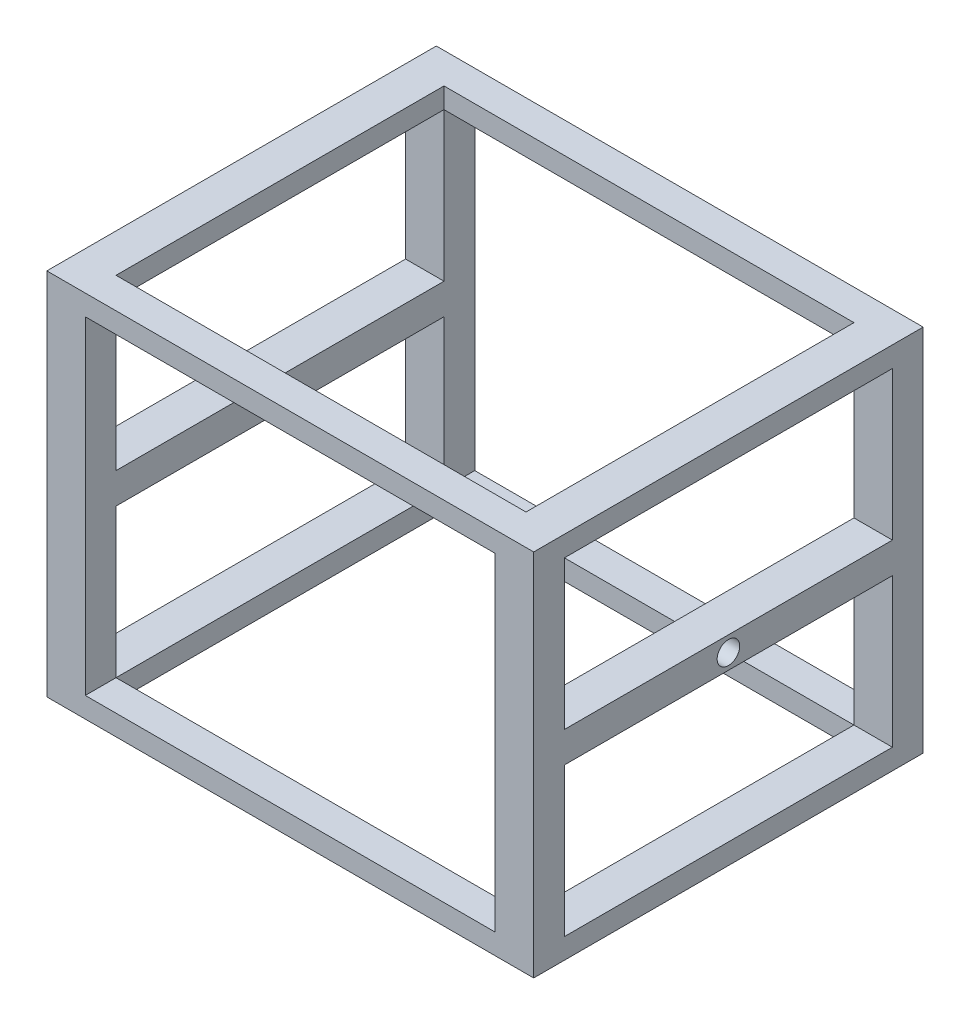
ISO-10303-21;
HEADER;
FILE_DESCRIPTION(('STEP AP214'),'2;1');
FILE_NAME('part.step','',(''),(''),'','','');
FILE_SCHEMA(('AUTOMOTIVE_DESIGN { 1 0 10303 214 1 1 1 1 }'));
ENDSEC;
DATA;
#1=APPLICATION_CONTEXT('core data for automotive mechanical design processes');
#2=APPLICATION_PROTOCOL_DEFINITION('international standard','automotive_design',2000,#1);
#3=PRODUCT_CONTEXT('',#1,'mechanical');
#4=PRODUCT('Part','Part','',(#3));
#5=PRODUCT_RELATED_PRODUCT_CATEGORY('part','',(#4));
#6=PRODUCT_DEFINITION_FORMATION('','',#4);
#7=PRODUCT_DEFINITION_CONTEXT('part definition',#1,'design');
#8=PRODUCT_DEFINITION('design','',#6,#7);
#9=PRODUCT_DEFINITION_SHAPE('','',#8);
#10=(LENGTH_UNIT() NAMED_UNIT(*) SI_UNIT(.MILLI.,.METRE.));
#11=(NAMED_UNIT(*) PLANE_ANGLE_UNIT() SI_UNIT($,.RADIAN.));
#12=(NAMED_UNIT(*) SI_UNIT($,.STERADIAN.) SOLID_ANGLE_UNIT());
#13=UNCERTAINTY_MEASURE_WITH_UNIT(LENGTH_MEASURE(1.E-05),#10,'distance_accuracy_value','');
#14=(GEOMETRIC_REPRESENTATION_CONTEXT(3) GLOBAL_UNCERTAINTY_ASSIGNED_CONTEXT((#13)) GLOBAL_UNIT_ASSIGNED_CONTEXT((#10,
#11,#12)) REPRESENTATION_CONTEXT('',''));
#15=CARTESIAN_POINT('',(0.,0.,0.));
#16=DIRECTION('',(0.,0.,1.));
#17=DIRECTION('',(1.,0.,0.));
#18=AXIS2_PLACEMENT_3D('',#15,#16,#17);
#19=CARTESIAN_POINT('',(-593.75,850.,-400.));
#20=DIRECTION('',(0.,0.,-1.));
#21=DIRECTION('',(-1.,0.,0.));
#22=AXIS2_PLACEMENT_3D('',#19,#20,#21);
#23=PLANE('',#22);
#24=DIRECTION('',(0.,-1.,0.));
#25=VECTOR('',#24,1.);
#26=CARTESIAN_POINT('',(-500.,850.,-400.));
#27=LINE('',#26,#25);
#28=CARTESIAN_POINT('',(-500.,412.5,-400.));
#29=VERTEX_POINT('',#28);
#30=CARTESIAN_POINT('',(-500.,50.,-400.));
#31=VERTEX_POINT('',#30);
#32=EDGE_CURVE('E408',#29,#31,#27,.T.);
#33=ORIENTED_EDGE('',*,*,#32,.F.);
#34=DIRECTION('',(-1.,0.,0.));
#35=VECTOR('',#34,1.);
#36=CARTESIAN_POINT('',(-593.75,412.5,-400.));
#37=LINE('',#36,#35);
#38=CARTESIAN_POINT('',(-593.75,412.5,-400.));
#39=VERTEX_POINT('',#38);
#40=EDGE_CURVE('E235',#29,#39,#37,.T.);
#41=ORIENTED_EDGE('',*,*,#40,.T.);
#42=DIRECTION('',(0.,-1.,0.));
#43=VECTOR('',#42,1.);
#44=CARTESIAN_POINT('',(-593.75,850.,-400.));
#45=LINE('',#44,#43);
#46=CARTESIAN_POINT('',(-593.75,50.,-400.));
#47=VERTEX_POINT('',#46);
#48=EDGE_CURVE('E437',#39,#47,#45,.T.);
#49=ORIENTED_EDGE('',*,*,#48,.T.);
#50=DIRECTION('',(1.,0.,0.));
#51=VECTOR('',#50,1.);
#52=CARTESIAN_POINT('',(-593.75,50.,-400.));
#53=LINE('',#52,#51);
#54=EDGE_CURVE('E388',#47,#31,#53,.T.);
#55=ORIENTED_EDGE('',*,*,#54,.T.);
#56=EDGE_LOOP('',(#33,#41,#49,#55));
#57=FACE_BOUND('',#56,.T.);
#58=ADVANCED_FACE('F33',(#57),#23,.F.);
#59=CARTESIAN_POINT('',(-500.,850.,400.));
#60=DIRECTION('',(0.,0.,1.));
#61=DIRECTION('',(1.,0.,0.));
#62=AXIS2_PLACEMENT_3D('',#59,#60,#61);
#63=PLANE('',#62);
#64=DIRECTION('',(0.,-1.,0.));
#65=VECTOR('',#64,1.);
#66=CARTESIAN_POINT('',(-593.75,850.,400.));
#67=LINE('',#66,#65);
#68=CARTESIAN_POINT('',(-593.75,412.5,400.));
#69=VERTEX_POINT('',#68);
#70=CARTESIAN_POINT('',(-593.75,50.,400.));
#71=VERTEX_POINT('',#70);
#72=EDGE_CURVE('E230',#69,#71,#67,.T.);
#73=ORIENTED_EDGE('',*,*,#72,.F.);
#74=DIRECTION('',(1.,0.,0.));
#75=VECTOR('',#74,1.);
#76=CARTESIAN_POINT('',(-500.,412.5,400.));
#77=LINE('',#76,#75);
#78=CARTESIAN_POINT('',(-500.,412.5,400.));
#79=VERTEX_POINT('',#78);
#80=EDGE_CURVE('E11',#69,#79,#77,.T.);
#81=ORIENTED_EDGE('',*,*,#80,.T.);
#82=DIRECTION('',(0.,-1.,0.));
#83=VECTOR('',#82,1.);
#84=CARTESIAN_POINT('',(-500.,850.,400.));
#85=LINE('',#84,#83);
#86=CARTESIAN_POINT('',(-500.,50.,400.));
#87=VERTEX_POINT('',#86);
#88=EDGE_CURVE('E218',#79,#87,#85,.T.);
#89=ORIENTED_EDGE('',*,*,#88,.T.);
#90=DIRECTION('',(-1.,0.,0.));
#91=VECTOR('',#90,1.);
#92=CARTESIAN_POINT('',(-500.,50.,400.));
#93=LINE('',#92,#91);
#94=EDGE_CURVE('E379',#87,#71,#93,.T.);
#95=ORIENTED_EDGE('',*,*,#94,.T.);
#96=EDGE_LOOP('',(#73,#81,#89,#95));
#97=FACE_BOUND('',#96,.T.);
#98=ADVANCED_FACE('F229',(#97),#63,.F.);
#99=CARTESIAN_POINT('',(500.,850.,-400.));
#100=DIRECTION('',(0.,0.,-1.));
#101=DIRECTION('',(-1.,0.,0.));
#102=AXIS2_PLACEMENT_3D('',#99,#100,#101);
#103=PLANE('',#102);
#104=DIRECTION('',(0.,-1.,0.));
#105=VECTOR('',#104,1.);
#106=CARTESIAN_POINT('',(500.,850.,-400.));
#107=LINE('',#106,#105);
#108=CARTESIAN_POINT('',(500.,850.,-400.));
#109=VERTEX_POINT('',#108);
#110=CARTESIAN_POINT('',(500.,487.5,-400.));
#111=VERTEX_POINT('',#110);
#112=EDGE_CURVE('E373',#109,#111,#107,.T.);
#113=ORIENTED_EDGE('',*,*,#112,.T.);
#114=DIRECTION('',(1.,0.,0.));
#115=VECTOR('',#114,1.);
#116=CARTESIAN_POINT('',(500.,487.5,-400.));
#117=LINE('',#116,#115);
#118=CARTESIAN_POINT('',(593.75,487.5,-400.));
#119=VERTEX_POINT('',#118);
#120=EDGE_CURVE('E274',#111,#119,#117,.T.);
#121=ORIENTED_EDGE('',*,*,#120,.T.);
#122=DIRECTION('',(0.,-1.,0.));
#123=VECTOR('',#122,1.);
#124=CARTESIAN_POINT('',(593.75,850.,-400.));
#125=LINE('',#124,#123);
#126=CARTESIAN_POINT('',(593.75,850.,-400.));
#127=VERTEX_POINT('',#126);
#128=EDGE_CURVE('E369',#127,#119,#125,.T.);
#129=ORIENTED_EDGE('',*,*,#128,.F.);
#130=DIRECTION('',(1.,0.,0.));
#131=VECTOR('',#130,1.);
#132=CARTESIAN_POINT('',(500.,850.,-400.));
#133=LINE('',#132,#131);
#134=EDGE_CURVE('E358',#109,#127,#133,.T.);
#135=ORIENTED_EDGE('',*,*,#134,.F.);
#136=EDGE_LOOP('',(#113,#121,#129,#135));
#137=FACE_BOUND('',#136,.T.);
#138=ADVANCED_FACE('F488',(#137),#103,.F.);
#139=CARTESIAN_POINT('',(593.75,850.,400.));
#140=DIRECTION('',(0.,0.,1.));
#141=DIRECTION('',(1.,0.,0.));
#142=AXIS2_PLACEMENT_3D('',#139,#140,#141);
#143=PLANE('',#142);
#144=DIRECTION('',(0.,-1.,0.));
#145=VECTOR('',#144,1.);
#146=CARTESIAN_POINT('',(593.75,850.,400.));
#147=LINE('',#146,#145);
#148=CARTESIAN_POINT('',(593.75,850.,400.));
#149=VERTEX_POINT('',#148);
#150=CARTESIAN_POINT('',(593.75,487.5,400.));
#151=VERTEX_POINT('',#150);
#152=EDGE_CURVE('E351',#149,#151,#147,.T.);
#153=ORIENTED_EDGE('',*,*,#152,.T.);
#154=DIRECTION('',(-1.,0.,0.));
#155=VECTOR('',#154,1.);
#156=CARTESIAN_POINT('',(593.75,487.5,400.));
#157=LINE('',#156,#155);
#158=CARTESIAN_POINT('',(500.,487.5,400.));
#159=VERTEX_POINT('',#158);
#160=EDGE_CURVE('E271',#151,#159,#157,.T.);
#161=ORIENTED_EDGE('',*,*,#160,.T.);
#162=DIRECTION('',(0.,-1.,0.));
#163=VECTOR('',#162,1.);
#164=CARTESIAN_POINT('',(500.,850.,400.));
#165=LINE('',#164,#163);
#166=CARTESIAN_POINT('',(500.,850.,400.));
#167=VERTEX_POINT('',#166);
#168=EDGE_CURVE('E347',#167,#159,#165,.T.);
#169=ORIENTED_EDGE('',*,*,#168,.F.);
#170=DIRECTION('',(-1.,0.,0.));
#171=VECTOR('',#170,1.);
#172=CARTESIAN_POINT('',(593.75,850.,400.));
#173=LINE('',#172,#171);
#174=EDGE_CURVE('E333',#149,#167,#173,.T.);
#175=ORIENTED_EDGE('',*,*,#174,.F.);
#176=EDGE_LOOP('',(#153,#161,#169,#175));
#177=FACE_BOUND('',#176,.T.);
#178=ADVANCED_FACE('F638',(#177),#143,.F.);
#179=CARTESIAN_POINT('',(0.,50.,0.));
#180=DIRECTION('',(0.,1.,0.));
#181=DIRECTION('',(0.,0.,1.));
#182=AXIS2_PLACEMENT_3D('',#179,#180,#181);
#183=PLANE('',#182);
#184=DIRECTION('',(0.,0.,-1.));
#185=VECTOR('',#184,1.);
#186=CARTESIAN_POINT('',(500.,50.,-400.));
#187=LINE('',#186,#185);
#188=CARTESIAN_POINT('',(500.,50.,400.));
#189=VERTEX_POINT('',#188);
#190=CARTESIAN_POINT('',(500.,50.,-400.));
#191=VERTEX_POINT('',#190);
#192=EDGE_CURVE('E478',#189,#191,#187,.T.);
#193=ORIENTED_EDGE('',*,*,#192,.F.);
#194=DIRECTION('',(-1.,0.,0.));
#195=VECTOR('',#194,1.);
#196=CARTESIAN_POINT('',(593.75,50.,400.));
#197=LINE('',#196,#195);
#198=CARTESIAN_POINT('',(593.75,50.,400.));
#199=VERTEX_POINT('',#198);
#200=EDGE_CURVE('E322',#199,#189,#197,.T.);
#201=ORIENTED_EDGE('',*,*,#200,.F.);
#202=DIRECTION('',(0.,0.,-1.));
#203=VECTOR('',#202,1.);
#204=CARTESIAN_POINT('',(593.75,50.,-475.));
#205=LINE('',#204,#203);
#206=CARTESIAN_POINT('',(593.75,50.,-400.));
#207=VERTEX_POINT('',#206);
#208=EDGE_CURVE('E416',#199,#207,#205,.T.);
#209=ORIENTED_EDGE('',*,*,#208,.T.);
#210=DIRECTION('',(1.,0.,0.));
#211=VECTOR('',#210,1.);
#212=CARTESIAN_POINT('',(500.,50.,-400.));
#213=LINE('',#212,#211);
#214=EDGE_CURVE('E359',#191,#207,#213,.T.);
#215=ORIENTED_EDGE('',*,*,#214,.F.);
#216=EDGE_LOOP('',(#193,#201,#209,#215));
#217=FACE_BOUND('',#216,.T.);
#218=ADVANCED_FACE('F517',(#217),#183,.T.);
#219=DIRECTION('',(1.,0.,0.));
#220=VECTOR('',#219,1.);
#221=CARTESIAN_POINT('',(-593.75,50.,475.));
#222=LINE('',#221,#220);
#223=CARTESIAN_POINT('',(-500.,50.,475.));
#224=VERTEX_POINT('',#223);
#225=CARTESIAN_POINT('',(500.,50.,475.));
#226=VERTEX_POINT('',#225);
#227=EDGE_CURVE('E423',#224,#226,#222,.T.);
#228=ORIENTED_EDGE('',*,*,#227,.T.);
#229=DIRECTION('',(0.,0.,1.));
#230=VECTOR('',#229,1.);
#231=CARTESIAN_POINT('',(500.,50.,475.));
#232=LINE('',#231,#230);
#233=EDGE_CURVE('E337',#189,#226,#232,.T.);
#234=ORIENTED_EDGE('',*,*,#233,.F.);
#235=DIRECTION('',(1.,0.,0.));
#236=VECTOR('',#235,1.);
#237=CARTESIAN_POINT('',(-500.,50.,400.));
#238=LINE('',#237,#236);
#239=EDGE_CURVE('E458',#87,#189,#238,.T.);
#240=ORIENTED_EDGE('',*,*,#239,.F.);
#241=DIRECTION('',(0.,0.,-1.));
#242=VECTOR('',#241,1.);
#243=CARTESIAN_POINT('',(-500.,50.,400.));
#244=LINE('',#243,#242);
#245=EDGE_CURVE('E222',#224,#87,#244,.T.);
#246=ORIENTED_EDGE('',*,*,#245,.F.);
#247=EDGE_LOOP('',(#228,#234,#240,#246));
#248=FACE_BOUND('',#247,.T.);
#249=ADVANCED_FACE('F516',(#248),#183,.T.);
#250=DIRECTION('',(-1.,0.,0.));
#251=VECTOR('',#250,1.);
#252=CARTESIAN_POINT('',(-500.,50.,-400.));
#253=LINE('',#252,#251);
#254=EDGE_CURVE('E459',#191,#31,#253,.T.);
#255=ORIENTED_EDGE('',*,*,#254,.F.);
#256=DIRECTION('',(0.,0.,1.));
#257=VECTOR('',#256,1.);
#258=CARTESIAN_POINT('',(500.,50.,-400.));
#259=LINE('',#258,#257);
#260=CARTESIAN_POINT('',(500.,50.,-475.));
#261=VERTEX_POINT('',#260);
#262=EDGE_CURVE('E354',#261,#191,#259,.T.);
#263=ORIENTED_EDGE('',*,*,#262,.F.);
#264=DIRECTION('',(-1.,0.,0.));
#265=VECTOR('',#264,1.);
#266=CARTESIAN_POINT('',(-593.75,50.,-475.));
#267=LINE('',#266,#265);
#268=CARTESIAN_POINT('',(-500.,50.,-475.));
#269=VERTEX_POINT('',#268);
#270=EDGE_CURVE('E411',#261,#269,#267,.T.);
#271=ORIENTED_EDGE('',*,*,#270,.T.);
#272=DIRECTION('',(0.,0.,-1.));
#273=VECTOR('',#272,1.);
#274=CARTESIAN_POINT('',(-500.,50.,-475.));
#275=LINE('',#274,#273);
#276=EDGE_CURVE('E393',#31,#269,#275,.T.);
#277=ORIENTED_EDGE('',*,*,#276,.F.);
#278=EDGE_LOOP('',(#255,#263,#271,#277));
#279=FACE_BOUND('',#278,.T.);
#280=ADVANCED_FACE('F480',(#279),#183,.T.);
#281=DIRECTION('',(0.,0.,1.));
#282=VECTOR('',#281,1.);
#283=CARTESIAN_POINT('',(-593.75,50.,-475.));
#284=LINE('',#283,#282);
#285=EDGE_CURVE('E415',#47,#71,#284,.T.);
#286=ORIENTED_EDGE('',*,*,#285,.T.);
#287=ORIENTED_EDGE('',*,*,#94,.F.);
#288=DIRECTION('',(0.,0.,1.));
#289=VECTOR('',#288,1.);
#290=CARTESIAN_POINT('',(-500.,50.,-400.));
#291=LINE('',#290,#289);
#292=EDGE_CURVE('E451',#31,#87,#291,.T.);
#293=ORIENTED_EDGE('',*,*,#292,.F.);
#294=ORIENTED_EDGE('',*,*,#54,.F.);
#295=EDGE_LOOP('',(#286,#287,#293,#294));
#296=FACE_BOUND('',#295,.T.);
#297=ADVANCED_FACE('F453',(#296),#183,.T.);
#298=CARTESIAN_POINT('',(0.,0.,0.));
#299=DIRECTION('',(0.,1.,0.));
#300=DIRECTION('',(0.,0.,1.));
#301=AXIS2_PLACEMENT_3D('',#298,#299,#300);
#302=PLANE('',#301);
#303=DIRECTION('',(0.,0.,-1.));
#304=VECTOR('',#303,1.);
#305=CARTESIAN_POINT('',(593.75,0.,-475.));
#306=LINE('',#305,#304);
#307=CARTESIAN_POINT('',(593.75,0.,475.));
#308=VERTEX_POINT('',#307);
#309=CARTESIAN_POINT('',(593.75,0.,-475.));
#310=VERTEX_POINT('',#309);
#311=EDGE_CURVE('E546',#308,#310,#306,.T.);
#312=ORIENTED_EDGE('',*,*,#311,.F.);
#313=DIRECTION('',(1.,0.,0.));
#314=VECTOR('',#313,1.);
#315=CARTESIAN_POINT('',(-593.75,0.,475.));
#316=LINE('',#315,#314);
#317=CARTESIAN_POINT('',(-593.75,0.,475.));
#318=VERTEX_POINT('',#317);
#319=EDGE_CURVE('E552',#318,#308,#316,.T.);
#320=ORIENTED_EDGE('',*,*,#319,.F.);
#321=DIRECTION('',(0.,0.,1.));
#322=VECTOR('',#321,1.);
#323=CARTESIAN_POINT('',(-593.75,0.,-475.));
#324=LINE('',#323,#322);
#325=CARTESIAN_POINT('',(-593.75,0.,-475.));
#326=VERTEX_POINT('',#325);
#327=EDGE_CURVE('E545',#326,#318,#324,.T.);
#328=ORIENTED_EDGE('',*,*,#327,.F.);
#329=DIRECTION('',(-1.,0.,0.));
#330=VECTOR('',#329,1.);
#331=CARTESIAN_POINT('',(-593.75,0.,-475.));
#332=LINE('',#331,#330);
#333=EDGE_CURVE('E538',#310,#326,#332,.T.);
#334=ORIENTED_EDGE('',*,*,#333,.F.);
#335=EDGE_LOOP('',(#312,#320,#328,#334));
#336=FACE_BOUND('',#335,.T.);
#337=DIRECTION('',(0.,0.,-1.));
#338=VECTOR('',#337,1.);
#339=CARTESIAN_POINT('',(500.,0.,-400.));
#340=LINE('',#339,#338);
#341=CARTESIAN_POINT('',(500.,0.,400.));
#342=VERTEX_POINT('',#341);
#343=CARTESIAN_POINT('',(500.,0.,-400.));
#344=VERTEX_POINT('',#343);
#345=EDGE_CURVE('E436',#342,#344,#340,.T.);
#346=ORIENTED_EDGE('',*,*,#345,.T.);
#347=DIRECTION('',(-1.,0.,0.));
#348=VECTOR('',#347,1.);
#349=CARTESIAN_POINT('',(-500.,0.,-400.));
#350=LINE('',#349,#348);
#351=CARTESIAN_POINT('',(-500.,0.,-400.));
#352=VERTEX_POINT('',#351);
#353=EDGE_CURVE('E441',#344,#352,#350,.T.);
#354=ORIENTED_EDGE('',*,*,#353,.T.);
#355=DIRECTION('',(0.,0.,1.));
#356=VECTOR('',#355,1.);
#357=CARTESIAN_POINT('',(-500.,0.,-400.));
#358=LINE('',#357,#356);
#359=CARTESIAN_POINT('',(-500.,0.,400.));
#360=VERTEX_POINT('',#359);
#361=EDGE_CURVE('E466',#352,#360,#358,.T.);
#362=ORIENTED_EDGE('',*,*,#361,.T.);
#363=DIRECTION('',(1.,0.,0.));
#364=VECTOR('',#363,1.);
#365=CARTESIAN_POINT('',(-500.,0.,400.));
#366=LINE('',#365,#364);
#367=EDGE_CURVE('E615',#360,#342,#366,.T.);
#368=ORIENTED_EDGE('',*,*,#367,.T.);
#369=EDGE_LOOP('',(#346,#354,#362,#368));
#370=FACE_BOUND('',#369,.T.);
#371=ADVANCED_FACE('F518',(#336,#370),#302,.F.);
#372=CARTESIAN_POINT('',(593.75,50.,-475.));
#373=DIRECTION('',(-1.,0.,0.));
#374=DIRECTION('',(0.,0.,1.));
#375=AXIS2_PLACEMENT_3D('',#372,#373,#374);
#376=PLANE('',#375);
#377=CARTESIAN_POINT('',(593.75,450.,0.));
#378=DIRECTION('',(-1.,0.,0.));
#379=DIRECTION('',(0.,0.,1.));
#380=AXIS2_PLACEMENT_3D('',#377,#378,#379);
#381=CIRCLE('',#380,27.5);
#382=CARTESIAN_POINT('',(593.75,450.,27.5));
#383=VERTEX_POINT('',#382);
#384=EDGE_CURVE('E247',#383,#383,#381,.F.);
#385=ORIENTED_EDGE('',*,*,#384,.F.);
#386=EDGE_LOOP('',(#385));
#387=FACE_BOUND('',#386,.T.);
#388=DIRECTION('',(0.,0.,1.));
#389=VECTOR('',#388,1.);
#390=CARTESIAN_POINT('',(593.75,487.5,475.));
#391=LINE('',#390,#389);
#392=EDGE_CURVE('E259',#119,#151,#391,.T.);
#393=ORIENTED_EDGE('',*,*,#392,.T.);
#394=ORIENTED_EDGE('',*,*,#152,.F.);
#395=DIRECTION('',(0.,0.,-1.));
#396=VECTOR('',#395,1.);
#397=CARTESIAN_POINT('',(593.75,850.,-475.));
#398=LINE('',#397,#396);
#399=EDGE_CURVE('E309',#149,#127,#398,.T.);
#400=ORIENTED_EDGE('',*,*,#399,.T.);
#401=ORIENTED_EDGE('',*,*,#128,.T.);
#402=EDGE_LOOP('',(#393,#394,#400,#401));
#403=FACE_BOUND('',#402,.T.);
#404=DIRECTION('',(0.,0.,-1.));
#405=VECTOR('',#404,1.);
#406=CARTESIAN_POINT('',(593.75,412.5,475.));
#407=LINE('',#406,#405);
#408=CARTESIAN_POINT('',(593.75,412.5,400.));
#409=VERTEX_POINT('',#408);
#410=CARTESIAN_POINT('',(593.75,412.5,-400.));
#411=VERTEX_POINT('',#410);
#412=EDGE_CURVE('E254',#409,#411,#407,.T.);
#413=ORIENTED_EDGE('',*,*,#412,.T.);
#414=EDGE_CURVE('E368',#411,#207,#125,.T.);
#415=ORIENTED_EDGE('',*,*,#414,.T.);
#416=ORIENTED_EDGE('',*,*,#208,.F.);
#417=EDGE_CURVE('E350',#409,#199,#147,.T.);
#418=ORIENTED_EDGE('',*,*,#417,.F.);
#419=EDGE_LOOP('',(#413,#415,#416,#418));
#420=FACE_BOUND('',#419,.T.);
#421=ORIENTED_EDGE('',*,*,#311,.T.);
#422=DIRECTION('',(0.,-1.,0.));
#423=VECTOR('',#422,1.);
#424=CARTESIAN_POINT('',(593.75,50.,-475.));
#425=LINE('',#424,#423);
#426=CARTESIAN_POINT('',(593.75,900.,-475.));
#427=VERTEX_POINT('',#426);
#428=EDGE_CURVE('E429',#427,#310,#425,.T.);
#429=ORIENTED_EDGE('',*,*,#428,.F.);
#430=DIRECTION('',(0.,0.,-1.));
#431=VECTOR('',#430,1.);
#432=CARTESIAN_POINT('',(593.75,900.,-475.));
#433=LINE('',#432,#431);
#434=CARTESIAN_POINT('',(593.75,900.,475.));
#435=VERTEX_POINT('',#434);
#436=EDGE_CURVE('E308',#435,#427,#433,.T.);
#437=ORIENTED_EDGE('',*,*,#436,.F.);
#438=DIRECTION('',(0.,-1.,0.));
#439=VECTOR('',#438,1.);
#440=CARTESIAN_POINT('',(593.75,50.,475.));
#441=LINE('',#440,#439);
#442=EDGE_CURVE('E557',#435,#308,#441,.T.);
#443=ORIENTED_EDGE('',*,*,#442,.T.);
#444=EDGE_LOOP('',(#421,#429,#437,#443));
#445=FACE_BOUND('',#444,.T.);
#446=ADVANCED_FACE('F35',(#387,#403,#420,#445),#376,.F.);
#447=CARTESIAN_POINT('',(-593.75,50.,-475.));
#448=DIRECTION('',(0.,0.,1.));
#449=DIRECTION('',(1.,0.,0.));
#450=AXIS2_PLACEMENT_3D('',#447,#448,#449);
#451=PLANE('',#450);
#452=DIRECTION('',(0.,-1.,0.));
#453=VECTOR('',#452,1.);
#454=CARTESIAN_POINT('',(-500.,850.,-475.));
#455=LINE('',#454,#453);
#456=CARTESIAN_POINT('',(-500.,850.,-475.));
#457=VERTEX_POINT('',#456);
#458=EDGE_CURVE('E396',#457,#269,#455,.T.);
#459=ORIENTED_EDGE('',*,*,#458,.T.);
#460=ORIENTED_EDGE('',*,*,#270,.F.);
#461=DIRECTION('',(0.,-1.,0.));
#462=VECTOR('',#461,1.);
#463=CARTESIAN_POINT('',(500.,850.,-475.));
#464=LINE('',#463,#462);
#465=CARTESIAN_POINT('',(500.,850.,-475.));
#466=VERTEX_POINT('',#465);
#467=EDGE_CURVE('E362',#466,#261,#464,.T.);
#468=ORIENTED_EDGE('',*,*,#467,.F.);
#469=DIRECTION('',(-1.,0.,0.));
#470=VECTOR('',#469,1.);
#471=CARTESIAN_POINT('',(-593.75,850.,-475.));
#472=LINE('',#471,#470);
#473=EDGE_CURVE('E319',#466,#457,#472,.T.);
#474=ORIENTED_EDGE('',*,*,#473,.T.);
#475=EDGE_LOOP('',(#459,#460,#468,#474));
#476=FACE_BOUND('',#475,.T.);
#477=ORIENTED_EDGE('',*,*,#333,.T.);
#478=DIRECTION('',(0.,-1.,0.));
#479=VECTOR('',#478,1.);
#480=CARTESIAN_POINT('',(-593.75,50.,-475.));
#481=LINE('',#480,#479);
#482=CARTESIAN_POINT('',(-593.75,900.,-475.));
#483=VERTEX_POINT('',#482);
#484=EDGE_CURVE('E541',#483,#326,#481,.T.);
#485=ORIENTED_EDGE('',*,*,#484,.F.);
#486=DIRECTION('',(-1.,0.,0.));
#487=VECTOR('',#486,1.);
#488=CARTESIAN_POINT('',(-593.75,900.,-475.));
#489=LINE('',#488,#487);
#490=EDGE_CURVE('E313',#427,#483,#489,.T.);
#491=ORIENTED_EDGE('',*,*,#490,.F.);
#492=ORIENTED_EDGE('',*,*,#428,.T.);
#493=EDGE_LOOP('',(#477,#485,#491,#492));
#494=FACE_BOUND('',#493,.T.);
#495=ADVANCED_FACE('F527',(#476,#494),#451,.F.);
#496=CARTESIAN_POINT('',(-593.75,50.,-475.));
#497=DIRECTION('',(1.,0.,0.));
#498=DIRECTION('',(0.,0.,-1.));
#499=AXIS2_PLACEMENT_3D('',#496,#497,#498);
#500=PLANE('',#499);
#501=CARTESIAN_POINT('',(-593.75,450.,0.));
#502=DIRECTION('',(1.,0.,0.));
#503=DIRECTION('',(0.,0.,-1.));
#504=AXIS2_PLACEMENT_3D('',#501,#502,#503);
#505=CIRCLE('',#504,27.5);
#506=CARTESIAN_POINT('',(-593.75,450.,-27.5));
#507=VERTEX_POINT('',#506);
#508=EDGE_CURVE('E976',#507,#507,#505,.F.);
#509=ORIENTED_EDGE('',*,*,#508,.F.);
#510=EDGE_LOOP('',(#509));
#511=FACE_BOUND('',#510,.T.);
#512=DIRECTION('',(0.,0.,1.));
#513=VECTOR('',#512,1.);
#514=CARTESIAN_POINT('',(-593.75,412.5,-475.));
#515=LINE('',#514,#513);
#516=EDGE_CURVE('E238',#39,#69,#515,.T.);
#517=ORIENTED_EDGE('',*,*,#516,.T.);
#518=ORIENTED_EDGE('',*,*,#72,.T.);
#519=ORIENTED_EDGE('',*,*,#285,.F.);
#520=ORIENTED_EDGE('',*,*,#48,.F.);
#521=EDGE_LOOP('',(#517,#518,#519,#520));
#522=FACE_BOUND('',#521,.T.);
#523=DIRECTION('',(0.,0.,-1.));
#524=VECTOR('',#523,1.);
#525=CARTESIAN_POINT('',(-593.75,487.5,-475.));
#526=LINE('',#525,#524);
#527=CARTESIAN_POINT('',(-593.75,487.5,400.));
#528=VERTEX_POINT('',#527);
#529=CARTESIAN_POINT('',(-593.75,487.5,-400.));
#530=VERTEX_POINT('',#529);
#531=EDGE_CURVE('E243',#528,#530,#526,.T.);
#532=ORIENTED_EDGE('',*,*,#531,.T.);
#533=CARTESIAN_POINT('',(-593.75,850.,-400.));
#534=VERTEX_POINT('',#533);
#535=EDGE_CURVE('E434',#534,#530,#45,.T.);
#536=ORIENTED_EDGE('',*,*,#535,.F.);
#537=DIRECTION('',(0.,0.,1.));
#538=VECTOR('',#537,1.);
#539=CARTESIAN_POINT('',(-593.75,850.,-475.));
#540=LINE('',#539,#538);
#541=CARTESIAN_POINT('',(-593.75,850.,400.));
#542=VERTEX_POINT('',#541);
#543=EDGE_CURVE('E316',#534,#542,#540,.T.);
#544=ORIENTED_EDGE('',*,*,#543,.T.);
#545=EDGE_CURVE('E226',#542,#528,#67,.T.);
#546=ORIENTED_EDGE('',*,*,#545,.T.);
#547=EDGE_LOOP('',(#532,#536,#544,#546));
#548=FACE_BOUND('',#547,.T.);
#549=ORIENTED_EDGE('',*,*,#484,.T.);
#550=ORIENTED_EDGE('',*,*,#327,.T.);
#551=DIRECTION('',(0.,-1.,0.));
#552=VECTOR('',#551,1.);
#553=CARTESIAN_POINT('',(-593.75,50.,475.));
#554=LINE('',#553,#552);
#555=CARTESIAN_POINT('',(-593.75,900.,475.));
#556=VERTEX_POINT('',#555);
#557=EDGE_CURVE('E559',#556,#318,#554,.T.);
#558=ORIENTED_EDGE('',*,*,#557,.F.);
#559=DIRECTION('',(0.,0.,1.));
#560=VECTOR('',#559,1.);
#561=CARTESIAN_POINT('',(-593.75,900.,-475.));
#562=LINE('',#561,#560);
#563=EDGE_CURVE('E328',#483,#556,#562,.T.);
#564=ORIENTED_EDGE('',*,*,#563,.F.);
#565=EDGE_LOOP('',(#549,#550,#558,#564));
#566=FACE_BOUND('',#565,.T.);
#567=ADVANCED_FACE('F524',(#511,#522,#548,#566),#500,.F.);
#568=CARTESIAN_POINT('',(-593.75,50.,475.));
#569=DIRECTION('',(0.,0.,-1.));
#570=DIRECTION('',(-1.,0.,0.));
#571=AXIS2_PLACEMENT_3D('',#568,#569,#570);
#572=PLANE('',#571);
#573=ORIENTED_EDGE('',*,*,#557,.T.);
#574=ORIENTED_EDGE('',*,*,#319,.T.);
#575=ORIENTED_EDGE('',*,*,#442,.F.);
#576=DIRECTION('',(1.,0.,0.));
#577=VECTOR('',#576,1.);
#578=CARTESIAN_POINT('',(-593.75,900.,475.));
#579=LINE('',#578,#577);
#580=EDGE_CURVE('E325',#556,#435,#579,.T.);
#581=ORIENTED_EDGE('',*,*,#580,.F.);
#582=EDGE_LOOP('',(#573,#574,#575,#581));
#583=FACE_BOUND('',#582,.T.);
#584=ORIENTED_EDGE('',*,*,#227,.F.);
#585=DIRECTION('',(0.,-1.,0.));
#586=VECTOR('',#585,1.);
#587=CARTESIAN_POINT('',(-500.,850.,475.));
#588=LINE('',#587,#586);
#589=CARTESIAN_POINT('',(-500.,850.,475.));
#590=VERTEX_POINT('',#589);
#591=EDGE_CURVE('E382',#590,#224,#588,.T.);
#592=ORIENTED_EDGE('',*,*,#591,.F.);
#593=DIRECTION('',(1.,0.,0.));
#594=VECTOR('',#593,1.);
#595=CARTESIAN_POINT('',(-593.75,850.,475.));
#596=LINE('',#595,#594);
#597=CARTESIAN_POINT('',(500.,850.,475.));
#598=VERTEX_POINT('',#597);
#599=EDGE_CURVE('E312',#590,#598,#596,.T.);
#600=ORIENTED_EDGE('',*,*,#599,.T.);
#601=DIRECTION('',(0.,-1.,0.));
#602=VECTOR('',#601,1.);
#603=CARTESIAN_POINT('',(500.,850.,475.));
#604=LINE('',#603,#602);
#605=EDGE_CURVE('E340',#598,#226,#604,.T.);
#606=ORIENTED_EDGE('',*,*,#605,.T.);
#607=EDGE_LOOP('',(#584,#592,#600,#606));
#608=FACE_BOUND('',#607,.T.);
#609=ADVANCED_FACE('F512',(#583,#608),#572,.F.);
#610=CARTESIAN_POINT('',(500.,50.,-400.));
#611=DIRECTION('',(-1.,0.,0.));
#612=DIRECTION('',(0.,0.,1.));
#613=AXIS2_PLACEMENT_3D('',#610,#611,#612);
#614=PLANE('',#613);
#615=ORIENTED_EDGE('',*,*,#345,.F.);
#616=DIRECTION('',(0.,-1.,0.));
#617=VECTOR('',#616,1.);
#618=CARTESIAN_POINT('',(500.,50.,400.));
#619=LINE('',#618,#617);
#620=EDGE_CURVE('E609',#189,#342,#619,.T.);
#621=ORIENTED_EDGE('',*,*,#620,.F.);
#622=ORIENTED_EDGE('',*,*,#192,.T.);
#623=DIRECTION('',(0.,-1.,0.));
#624=VECTOR('',#623,1.);
#625=CARTESIAN_POINT('',(500.,50.,-400.));
#626=LINE('',#625,#624);
#627=EDGE_CURVE('E469',#191,#344,#626,.T.);
#628=ORIENTED_EDGE('',*,*,#627,.T.);
#629=EDGE_LOOP('',(#615,#621,#622,#628));
#630=FACE_BOUND('',#629,.T.);
#631=ADVANCED_FACE('F509',(#630),#614,.T.);
#632=CARTESIAN_POINT('',(-500.,50.,-400.));
#633=DIRECTION('',(0.,0.,1.));
#634=DIRECTION('',(1.,0.,0.));
#635=AXIS2_PLACEMENT_3D('',#632,#633,#634);
#636=PLANE('',#635);
#637=ORIENTED_EDGE('',*,*,#353,.F.);
#638=ORIENTED_EDGE('',*,*,#627,.F.);
#639=ORIENTED_EDGE('',*,*,#254,.T.);
#640=DIRECTION('',(0.,-1.,0.));
#641=VECTOR('',#640,1.);
#642=CARTESIAN_POINT('',(-500.,50.,-400.));
#643=LINE('',#642,#641);
#644=EDGE_CURVE('E462',#31,#352,#643,.T.);
#645=ORIENTED_EDGE('',*,*,#644,.T.);
#646=EDGE_LOOP('',(#637,#638,#639,#645));
#647=FACE_BOUND('',#646,.T.);
#648=ADVANCED_FACE('F474',(#647),#636,.T.);
#649=CARTESIAN_POINT('',(-500.,50.,-400.));
#650=DIRECTION('',(1.,0.,0.));
#651=DIRECTION('',(0.,0.,-1.));
#652=AXIS2_PLACEMENT_3D('',#649,#650,#651);
#653=PLANE('',#652);
#654=ORIENTED_EDGE('',*,*,#361,.F.);
#655=ORIENTED_EDGE('',*,*,#644,.F.);
#656=ORIENTED_EDGE('',*,*,#292,.T.);
#657=DIRECTION('',(0.,-1.,0.));
#658=VECTOR('',#657,1.);
#659=CARTESIAN_POINT('',(-500.,50.,400.));
#660=LINE('',#659,#658);
#661=EDGE_CURVE('E470',#87,#360,#660,.T.);
#662=ORIENTED_EDGE('',*,*,#661,.T.);
#663=EDGE_LOOP('',(#654,#655,#656,#662));
#664=FACE_BOUND('',#663,.T.);
#665=ADVANCED_FACE('F464',(#664),#653,.T.);
#666=CARTESIAN_POINT('',(-500.,50.,400.));
#667=DIRECTION('',(0.,0.,-1.));
#668=DIRECTION('',(-1.,0.,0.));
#669=AXIS2_PLACEMENT_3D('',#666,#667,#668);
#670=PLANE('',#669);
#671=ORIENTED_EDGE('',*,*,#367,.F.);
#672=ORIENTED_EDGE('',*,*,#661,.F.);
#673=ORIENTED_EDGE('',*,*,#239,.T.);
#674=ORIENTED_EDGE('',*,*,#620,.T.);
#675=EDGE_LOOP('',(#671,#672,#673,#674));
#676=FACE_BOUND('',#675,.T.);
#677=ADVANCED_FACE('F494',(#676),#670,.T.);
#678=ORIENTED_EDGE('',*,*,#535,.T.);
#679=DIRECTION('',(1.,0.,0.));
#680=VECTOR('',#679,1.);
#681=CARTESIAN_POINT('',(-593.75,487.5,-400.));
#682=LINE('',#681,#680);
#683=CARTESIAN_POINT('',(-500.,487.5,-400.));
#684=VERTEX_POINT('',#683);
#685=EDGE_CURVE('E241',#530,#684,#682,.T.);
#686=ORIENTED_EDGE('',*,*,#685,.T.);
#687=CARTESIAN_POINT('',(-500.,850.,-400.));
#688=VERTEX_POINT('',#687);
#689=EDGE_CURVE('E399',#688,#684,#27,.T.);
#690=ORIENTED_EDGE('',*,*,#689,.F.);
#691=DIRECTION('',(1.,0.,0.));
#692=VECTOR('',#691,1.);
#693=CARTESIAN_POINT('',(-593.75,850.,-400.));
#694=LINE('',#693,#692);
#695=EDGE_CURVE('E389',#534,#688,#694,.T.);
#696=ORIENTED_EDGE('',*,*,#695,.F.);
#697=EDGE_LOOP('',(#678,#686,#690,#696));
#698=FACE_BOUND('',#697,.T.);
#699=ADVANCED_FACE('F484',(#698),#23,.F.);
#700=CARTESIAN_POINT('',(-500.,850.,-475.));
#701=DIRECTION('',(-1.,0.,0.));
#702=DIRECTION('',(0.,0.,1.));
#703=AXIS2_PLACEMENT_3D('',#700,#701,#702);
#704=PLANE('',#703);
#705=CARTESIAN_POINT('',(-500.,450.,0.));
#706=DIRECTION('',(-1.,0.,0.));
#707=DIRECTION('',(0.,0.,1.));
#708=AXIS2_PLACEMENT_3D('',#705,#706,#707);
#709=CIRCLE('',#708,27.5);
#710=CARTESIAN_POINT('',(-500.,450.,27.5));
#711=VERTEX_POINT('',#710);
#712=EDGE_CURVE('E973',#711,#711,#709,.F.);
#713=ORIENTED_EDGE('',*,*,#712,.F.);
#714=EDGE_LOOP('',(#713));
#715=FACE_BOUND('',#714,.T.);
#716=ORIENTED_EDGE('',*,*,#689,.T.);
#717=DIRECTION('',(0.,0.,1.));
#718=VECTOR('',#717,1.);
#719=CARTESIAN_POINT('',(-500.,487.5,-475.));
#720=LINE('',#719,#718);
#721=CARTESIAN_POINT('',(-500.,487.5,400.));
#722=VERTEX_POINT('',#721);
#723=EDGE_CURVE('E237',#684,#722,#720,.T.);
#724=ORIENTED_EDGE('',*,*,#723,.T.);
#725=CARTESIAN_POINT('',(-500.,850.,400.));
#726=VERTEX_POINT('',#725);
#727=EDGE_CURVE('E58',#726,#722,#85,.T.);
#728=ORIENTED_EDGE('',*,*,#727,.F.);
#729=DIRECTION('',(0.,0.,-1.));
#730=VECTOR('',#729,1.);
#731=CARTESIAN_POINT('',(-500.,850.,400.));
#732=LINE('',#731,#730);
#733=EDGE_CURVE('E375',#590,#726,#732,.T.);
#734=ORIENTED_EDGE('',*,*,#733,.F.);
#735=ORIENTED_EDGE('',*,*,#591,.T.);
#736=ORIENTED_EDGE('',*,*,#245,.T.);
#737=ORIENTED_EDGE('',*,*,#88,.F.);
#738=DIRECTION('',(0.,0.,-1.));
#739=VECTOR('',#738,1.);
#740=CARTESIAN_POINT('',(-500.,412.5,-475.));
#741=LINE('',#740,#739);
#742=EDGE_CURVE('E50',#79,#29,#741,.T.);
#743=ORIENTED_EDGE('',*,*,#742,.T.);
#744=ORIENTED_EDGE('',*,*,#32,.T.);
#745=ORIENTED_EDGE('',*,*,#276,.T.);
#746=ORIENTED_EDGE('',*,*,#458,.F.);
#747=DIRECTION('',(0.,0.,-1.));
#748=VECTOR('',#747,1.);
#749=CARTESIAN_POINT('',(-500.,850.,-475.));
#750=LINE('',#749,#748);
#751=EDGE_CURVE('E392',#688,#457,#750,.T.);
#752=ORIENTED_EDGE('',*,*,#751,.F.);
#753=EDGE_LOOP('',(#716,#724,#728,#734,#735,#736,#737,#743,#744,#745,#746,#752));
#754=FACE_BOUND('',#753,.T.);
#755=ADVANCED_FACE('F220',(#715,#754),#704,.F.);
#756=ORIENTED_EDGE('',*,*,#727,.T.);
#757=DIRECTION('',(-1.,0.,0.));
#758=VECTOR('',#757,1.);
#759=CARTESIAN_POINT('',(-500.,487.5,400.));
#760=LINE('',#759,#758);
#761=EDGE_CURVE('E42',#722,#528,#760,.T.);
#762=ORIENTED_EDGE('',*,*,#761,.T.);
#763=ORIENTED_EDGE('',*,*,#545,.F.);
#764=DIRECTION('',(-1.,0.,0.));
#765=VECTOR('',#764,1.);
#766=CARTESIAN_POINT('',(-500.,850.,400.));
#767=LINE('',#766,#765);
#768=EDGE_CURVE('E378',#726,#542,#767,.T.);
#769=ORIENTED_EDGE('',*,*,#768,.F.);
#770=EDGE_LOOP('',(#756,#762,#763,#769));
#771=FACE_BOUND('',#770,.T.);
#772=ADVANCED_FACE('F490',(#771),#63,.F.);
#773=CARTESIAN_POINT('',(500.,850.,-400.));
#774=DIRECTION('',(1.,0.,0.));
#775=DIRECTION('',(0.,0.,-1.));
#776=AXIS2_PLACEMENT_3D('',#773,#774,#775);
#777=PLANE('',#776);
#778=CARTESIAN_POINT('',(500.,450.,0.));
#779=DIRECTION('',(1.,0.,0.));
#780=DIRECTION('',(0.,0.,-1.));
#781=AXIS2_PLACEMENT_3D('',#778,#779,#780);
#782=CIRCLE('',#781,27.5);
#783=CARTESIAN_POINT('',(500.,450.,-27.5));
#784=VERTEX_POINT('',#783);
#785=EDGE_CURVE('E37',#784,#784,#782,.F.);
#786=ORIENTED_EDGE('',*,*,#785,.F.);
#787=EDGE_LOOP('',(#786));
#788=FACE_BOUND('',#787,.T.);
#789=CARTESIAN_POINT('',(500.,412.5,-400.));
#790=VERTEX_POINT('',#789);
#791=EDGE_CURVE('E372',#790,#191,#107,.T.);
#792=ORIENTED_EDGE('',*,*,#791,.F.);
#793=DIRECTION('',(0.,0.,1.));
#794=VECTOR('',#793,1.);
#795=CARTESIAN_POINT('',(500.,412.5,475.));
#796=LINE('',#795,#794);
#797=CARTESIAN_POINT('',(500.,412.5,400.));
#798=VERTEX_POINT('',#797);
#799=EDGE_CURVE('E258',#790,#798,#796,.T.);
#800=ORIENTED_EDGE('',*,*,#799,.T.);
#801=EDGE_CURVE('E346',#798,#189,#165,.T.);
#802=ORIENTED_EDGE('',*,*,#801,.T.);
#803=ORIENTED_EDGE('',*,*,#233,.T.);
#804=ORIENTED_EDGE('',*,*,#605,.F.);
#805=DIRECTION('',(0.,0.,1.));
#806=VECTOR('',#805,1.);
#807=CARTESIAN_POINT('',(500.,850.,475.));
#808=LINE('',#807,#806);
#809=EDGE_CURVE('E336',#167,#598,#808,.T.);
#810=ORIENTED_EDGE('',*,*,#809,.F.);
#811=ORIENTED_EDGE('',*,*,#168,.T.);
#812=DIRECTION('',(0.,0.,-1.));
#813=VECTOR('',#812,1.);
#814=CARTESIAN_POINT('',(500.,487.5,475.));
#815=LINE('',#814,#813);
#816=EDGE_CURVE('E255',#159,#111,#815,.T.);
#817=ORIENTED_EDGE('',*,*,#816,.T.);
#818=ORIENTED_EDGE('',*,*,#112,.F.);
#819=DIRECTION('',(0.,0.,1.));
#820=VECTOR('',#819,1.);
#821=CARTESIAN_POINT('',(500.,850.,-400.));
#822=LINE('',#821,#820);
#823=EDGE_CURVE('E355',#466,#109,#822,.T.);
#824=ORIENTED_EDGE('',*,*,#823,.F.);
#825=ORIENTED_EDGE('',*,*,#467,.T.);
#826=ORIENTED_EDGE('',*,*,#262,.T.);
#827=EDGE_LOOP('',(#792,#800,#802,#803,#804,#810,#811,#817,#818,#824,#825,#826));
#828=FACE_BOUND('',#827,.T.);
#829=ADVANCED_FACE('F641',(#788,#828),#777,.F.);
#830=ORIENTED_EDGE('',*,*,#414,.F.);
#831=DIRECTION('',(-1.,0.,0.));
#832=VECTOR('',#831,1.);
#833=CARTESIAN_POINT('',(500.,412.5,-400.));
#834=LINE('',#833,#832);
#835=EDGE_CURVE('E268',#411,#790,#834,.T.);
#836=ORIENTED_EDGE('',*,*,#835,.T.);
#837=ORIENTED_EDGE('',*,*,#791,.T.);
#838=ORIENTED_EDGE('',*,*,#214,.T.);
#839=EDGE_LOOP('',(#830,#836,#837,#838));
#840=FACE_BOUND('',#839,.T.);
#841=ADVANCED_FACE('F636',(#840),#103,.F.);
#842=ORIENTED_EDGE('',*,*,#801,.F.);
#843=DIRECTION('',(1.,0.,0.));
#844=VECTOR('',#843,1.);
#845=CARTESIAN_POINT('',(593.75,412.5,400.));
#846=LINE('',#845,#844);
#847=EDGE_CURVE('E265',#798,#409,#846,.T.);
#848=ORIENTED_EDGE('',*,*,#847,.T.);
#849=ORIENTED_EDGE('',*,*,#417,.T.);
#850=ORIENTED_EDGE('',*,*,#200,.T.);
#851=EDGE_LOOP('',(#842,#848,#849,#850));
#852=FACE_BOUND('',#851,.T.);
#853=ADVANCED_FACE('F633',(#852),#143,.F.);
#854=CARTESIAN_POINT('',(0.,850.,0.));
#855=DIRECTION('',(0.,-1.,0.));
#856=DIRECTION('',(0.,0.,1.));
#857=AXIS2_PLACEMENT_3D('',#854,#855,#856);
#858=PLANE('',#857);
#859=ORIENTED_EDGE('',*,*,#695,.T.);
#860=DIRECTION('',(0.,0.,1.));
#861=VECTOR('',#860,1.);
#862=CARTESIAN_POINT('',(-500.,850.,-400.));
#863=LINE('',#862,#861);
#864=EDGE_CURVE('E284',#688,#726,#863,.T.);
#865=ORIENTED_EDGE('',*,*,#864,.T.);
#866=ORIENTED_EDGE('',*,*,#768,.T.);
#867=ORIENTED_EDGE('',*,*,#543,.F.);
#868=EDGE_LOOP('',(#859,#865,#866,#867));
#869=FACE_BOUND('',#868,.T.);
#870=ADVANCED_FACE('F569',(#869),#858,.T.);
#871=ORIENTED_EDGE('',*,*,#751,.T.);
#872=ORIENTED_EDGE('',*,*,#473,.F.);
#873=ORIENTED_EDGE('',*,*,#823,.T.);
#874=DIRECTION('',(-1.,0.,0.));
#875=VECTOR('',#874,1.);
#876=CARTESIAN_POINT('',(-500.,850.,-400.));
#877=LINE('',#876,#875);
#878=EDGE_CURVE('E287',#109,#688,#877,.T.);
#879=ORIENTED_EDGE('',*,*,#878,.T.);
#880=EDGE_LOOP('',(#871,#872,#873,#879));
#881=FACE_BOUND('',#880,.T.);
#882=ADVANCED_FACE('F580',(#881),#858,.T.);
#883=ORIENTED_EDGE('',*,*,#733,.T.);
#884=DIRECTION('',(1.,0.,0.));
#885=VECTOR('',#884,1.);
#886=CARTESIAN_POINT('',(-500.,850.,400.));
#887=LINE('',#886,#885);
#888=EDGE_CURVE('E280',#726,#167,#887,.T.);
#889=ORIENTED_EDGE('',*,*,#888,.T.);
#890=ORIENTED_EDGE('',*,*,#809,.T.);
#891=ORIENTED_EDGE('',*,*,#599,.F.);
#892=EDGE_LOOP('',(#883,#889,#890,#891));
#893=FACE_BOUND('',#892,.T.);
#894=ADVANCED_FACE('F597',(#893),#858,.T.);
#895=ORIENTED_EDGE('',*,*,#134,.T.);
#896=ORIENTED_EDGE('',*,*,#399,.F.);
#897=ORIENTED_EDGE('',*,*,#174,.T.);
#898=DIRECTION('',(0.,0.,-1.));
#899=VECTOR('',#898,1.);
#900=CARTESIAN_POINT('',(500.,850.,-400.));
#901=LINE('',#900,#899);
#902=EDGE_CURVE('E277',#167,#109,#901,.T.);
#903=ORIENTED_EDGE('',*,*,#902,.T.);
#904=EDGE_LOOP('',(#895,#896,#897,#903));
#905=FACE_BOUND('',#904,.T.);
#906=ADVANCED_FACE('F623',(#905),#858,.T.);
#907=CARTESIAN_POINT('',(0.,900.,0.));
#908=DIRECTION('',(0.,-1.,0.));
#909=DIRECTION('',(0.,0.,1.));
#910=AXIS2_PLACEMENT_3D('',#907,#908,#909);
#911=PLANE('',#910);
#912=DIRECTION('',(-1.,0.,0.));
#913=VECTOR('',#912,1.);
#914=CARTESIAN_POINT('',(-500.,900.,-400.));
#915=LINE('',#914,#913);
#916=CARTESIAN_POINT('',(500.,900.,-400.));
#917=VERTEX_POINT('',#916);
#918=CARTESIAN_POINT('',(-500.,900.,-400.));
#919=VERTEX_POINT('',#918);
#920=EDGE_CURVE('E281',#917,#919,#915,.T.);
#921=ORIENTED_EDGE('',*,*,#920,.F.);
#922=DIRECTION('',(0.,0.,-1.));
#923=VECTOR('',#922,1.);
#924=CARTESIAN_POINT('',(500.,900.,-400.));
#925=LINE('',#924,#923);
#926=CARTESIAN_POINT('',(500.,900.,400.));
#927=VERTEX_POINT('',#926);
#928=EDGE_CURVE('E276',#927,#917,#925,.T.);
#929=ORIENTED_EDGE('',*,*,#928,.F.);
#930=DIRECTION('',(1.,0.,0.));
#931=VECTOR('',#930,1.);
#932=CARTESIAN_POINT('',(-500.,900.,400.));
#933=LINE('',#932,#931);
#934=CARTESIAN_POINT('',(-500.,900.,400.));
#935=VERTEX_POINT('',#934);
#936=EDGE_CURVE('E292',#935,#927,#933,.T.);
#937=ORIENTED_EDGE('',*,*,#936,.F.);
#938=DIRECTION('',(0.,0.,1.));
#939=VECTOR('',#938,1.);
#940=CARTESIAN_POINT('',(-500.,900.,-400.));
#941=LINE('',#940,#939);
#942=EDGE_CURVE('E295',#919,#935,#941,.T.);
#943=ORIENTED_EDGE('',*,*,#942,.F.);
#944=EDGE_LOOP('',(#921,#929,#937,#943));
#945=FACE_BOUND('',#944,.T.);
#946=ORIENTED_EDGE('',*,*,#436,.T.);
#947=ORIENTED_EDGE('',*,*,#490,.T.);
#948=ORIENTED_EDGE('',*,*,#563,.T.);
#949=ORIENTED_EDGE('',*,*,#580,.T.);
#950=EDGE_LOOP('',(#946,#947,#948,#949));
#951=FACE_BOUND('',#950,.T.);
#952=ADVANCED_FACE('F590',(#945,#951),#911,.F.);
#953=CARTESIAN_POINT('',(500.,850.,-400.));
#954=DIRECTION('',(1.,0.,0.));
#955=DIRECTION('',(0.,0.,-1.));
#956=AXIS2_PLACEMENT_3D('',#953,#954,#955);
#957=PLANE('',#956);
#958=ORIENTED_EDGE('',*,*,#928,.T.);
#959=DIRECTION('',(0.,1.,0.));
#960=VECTOR('',#959,1.);
#961=CARTESIAN_POINT('',(500.,850.,-400.));
#962=LINE('',#961,#960);
#963=EDGE_CURVE('E290',#109,#917,#962,.T.);
#964=ORIENTED_EDGE('',*,*,#963,.F.);
#965=ORIENTED_EDGE('',*,*,#902,.F.);
#966=DIRECTION('',(0.,1.,0.));
#967=VECTOR('',#966,1.);
#968=CARTESIAN_POINT('',(500.,850.,400.));
#969=LINE('',#968,#967);
#970=EDGE_CURVE('E306',#167,#927,#969,.T.);
#971=ORIENTED_EDGE('',*,*,#970,.T.);
#972=EDGE_LOOP('',(#958,#964,#965,#971));
#973=FACE_BOUND('',#972,.T.);
#974=ADVANCED_FACE('F587',(#973),#957,.F.);
#975=CARTESIAN_POINT('',(-500.,850.,400.));
#976=DIRECTION('',(0.,0.,1.));
#977=DIRECTION('',(1.,0.,0.));
#978=AXIS2_PLACEMENT_3D('',#975,#976,#977);
#979=PLANE('',#978);
#980=ORIENTED_EDGE('',*,*,#936,.T.);
#981=ORIENTED_EDGE('',*,*,#970,.F.);
#982=ORIENTED_EDGE('',*,*,#888,.F.);
#983=DIRECTION('',(0.,1.,0.));
#984=VECTOR('',#983,1.);
#985=CARTESIAN_POINT('',(-500.,850.,400.));
#986=LINE('',#985,#984);
#987=EDGE_CURVE('E304',#726,#935,#986,.T.);
#988=ORIENTED_EDGE('',*,*,#987,.T.);
#989=EDGE_LOOP('',(#980,#981,#982,#988));
#990=FACE_BOUND('',#989,.T.);
#991=ADVANCED_FACE('F595',(#990),#979,.F.);
#992=CARTESIAN_POINT('',(-500.,850.,-400.));
#993=DIRECTION('',(-1.,0.,0.));
#994=DIRECTION('',(0.,0.,1.));
#995=AXIS2_PLACEMENT_3D('',#992,#993,#994);
#996=PLANE('',#995);
#997=ORIENTED_EDGE('',*,*,#942,.T.);
#998=ORIENTED_EDGE('',*,*,#987,.F.);
#999=ORIENTED_EDGE('',*,*,#864,.F.);
#1000=DIRECTION('',(0.,1.,0.));
#1001=VECTOR('',#1000,1.);
#1002=CARTESIAN_POINT('',(-500.,850.,-400.));
#1003=LINE('',#1002,#1001);
#1004=EDGE_CURVE('E302',#688,#919,#1003,.T.);
#1005=ORIENTED_EDGE('',*,*,#1004,.T.);
#1006=EDGE_LOOP('',(#997,#998,#999,#1005));
#1007=FACE_BOUND('',#1006,.T.);
#1008=ADVANCED_FACE('F573',(#1007),#996,.F.);
#1009=CARTESIAN_POINT('',(-500.,850.,-400.));
#1010=DIRECTION('',(0.,0.,-1.));
#1011=DIRECTION('',(-1.,0.,0.));
#1012=AXIS2_PLACEMENT_3D('',#1009,#1010,#1011);
#1013=PLANE('',#1012);
#1014=ORIENTED_EDGE('',*,*,#920,.T.);
#1015=ORIENTED_EDGE('',*,*,#1004,.F.);
#1016=ORIENTED_EDGE('',*,*,#878,.F.);
#1017=ORIENTED_EDGE('',*,*,#963,.T.);
#1018=EDGE_LOOP('',(#1014,#1015,#1016,#1017));
#1019=FACE_BOUND('',#1018,.T.);
#1020=ADVANCED_FACE('F577',(#1019),#1013,.F.);
#1021=CARTESIAN_POINT('',(-452.955927627296,487.5,475.));
#1022=DIRECTION('',(0.,1.,0.));
#1023=DIRECTION('',(0.,0.,1.));
#1024=AXIS2_PLACEMENT_3D('',#1021,#1022,#1023);
#1025=PLANE('',#1024);
#1026=ORIENTED_EDGE('',*,*,#120,.F.);
#1027=ORIENTED_EDGE('',*,*,#816,.F.);
#1028=ORIENTED_EDGE('',*,*,#160,.F.);
#1029=ORIENTED_EDGE('',*,*,#392,.F.);
#1030=EDGE_LOOP('',(#1026,#1027,#1028,#1029));
#1031=FACE_BOUND('',#1030,.T.);
#1032=ADVANCED_FACE('F720',(#1031),#1025,.T.);
#1033=CARTESIAN_POINT('',(-452.955927627296,412.5,475.));
#1034=DIRECTION('',(0.,-1.,0.));
#1035=DIRECTION('',(0.,0.,-1.));
#1036=AXIS2_PLACEMENT_3D('',#1033,#1034,#1035);
#1037=PLANE('',#1036);
#1038=ORIENTED_EDGE('',*,*,#835,.F.);
#1039=ORIENTED_EDGE('',*,*,#412,.F.);
#1040=ORIENTED_EDGE('',*,*,#847,.F.);
#1041=ORIENTED_EDGE('',*,*,#799,.F.);
#1042=EDGE_LOOP('',(#1038,#1039,#1040,#1041));
#1043=FACE_BOUND('',#1042,.T.);
#1044=ADVANCED_FACE('F797',(#1043),#1037,.T.);
#1045=CARTESIAN_POINT('',(452.955927627296,412.5,-475.));
#1046=DIRECTION('',(0.,-1.,0.));
#1047=DIRECTION('',(0.,0.,-1.));
#1048=AXIS2_PLACEMENT_3D('',#1045,#1046,#1047);
#1049=PLANE('',#1048);
#1050=ORIENTED_EDGE('',*,*,#40,.F.);
#1051=ORIENTED_EDGE('',*,*,#742,.F.);
#1052=ORIENTED_EDGE('',*,*,#80,.F.);
#1053=ORIENTED_EDGE('',*,*,#516,.F.);
#1054=EDGE_LOOP('',(#1050,#1051,#1052,#1053));
#1055=FACE_BOUND('',#1054,.T.);
#1056=ADVANCED_FACE('F233',(#1055),#1049,.T.);
#1057=CARTESIAN_POINT('',(452.955927627296,487.5,-475.));
#1058=DIRECTION('',(0.,1.,0.));
#1059=DIRECTION('',(0.,0.,1.));
#1060=AXIS2_PLACEMENT_3D('',#1057,#1058,#1059);
#1061=PLANE('',#1060);
#1062=ORIENTED_EDGE('',*,*,#685,.F.);
#1063=ORIENTED_EDGE('',*,*,#531,.F.);
#1064=ORIENTED_EDGE('',*,*,#761,.F.);
#1065=ORIENTED_EDGE('',*,*,#723,.F.);
#1066=EDGE_LOOP('',(#1062,#1063,#1064,#1065));
#1067=FACE_BOUND('',#1066,.T.);
#1068=ADVANCED_FACE('F564',(#1067),#1061,.T.);
#1069=CARTESIAN_POINT('',(2593.75,450.,0.));
#1070=DIRECTION('',(-1.,0.,0.));
#1071=DIRECTION('',(0.,0.,1.));
#1072=AXIS2_PLACEMENT_3D('',#1069,#1070,#1071);
#1073=CYLINDRICAL_SURFACE('',#1072,27.5);
#1074=ORIENTED_EDGE('',*,*,#785,.T.);
#1075=EDGE_LOOP('',(#1074));
#1076=FACE_BOUND('',#1075,.T.);
#1077=ORIENTED_EDGE('',*,*,#384,.T.);
#1078=EDGE_LOOP('',(#1077));
#1079=FACE_BOUND('',#1078,.T.);
#1080=ADVANCED_FACE('F803',(#1076,#1079),#1073,.F.);
#1081=ORIENTED_EDGE('',*,*,#712,.T.);
#1082=EDGE_LOOP('',(#1081));
#1083=FACE_BOUND('',#1082,.T.);
#1084=ORIENTED_EDGE('',*,*,#508,.T.);
#1085=EDGE_LOOP('',(#1084));
#1086=FACE_BOUND('',#1085,.T.);
#1087=ADVANCED_FACE('F809',(#1083,#1086),#1073,.F.);
#1088=CLOSED_SHELL('',(#58,#98,#138,#178,#218,#249,#280,#297,#371,#446,#495,#567,#609,#631,#648,
#665,#677,#699,#755,#772,#829,#841,#853,#870,#882,#894,#906,#952,#974,#991,#1008,#1020,#1032,
#1044,#1056,#1068,#1080,#1087));
#1089=MANIFOLD_SOLID_BREP('B2',#1088);
#1090=ADVANCED_BREP_SHAPE_REPRESENTATION('',(#18,#1089),#14);
#1091=SHAPE_DEFINITION_REPRESENTATION(#9,#1090);
ENDSEC;
END-ISO-10303-21;
